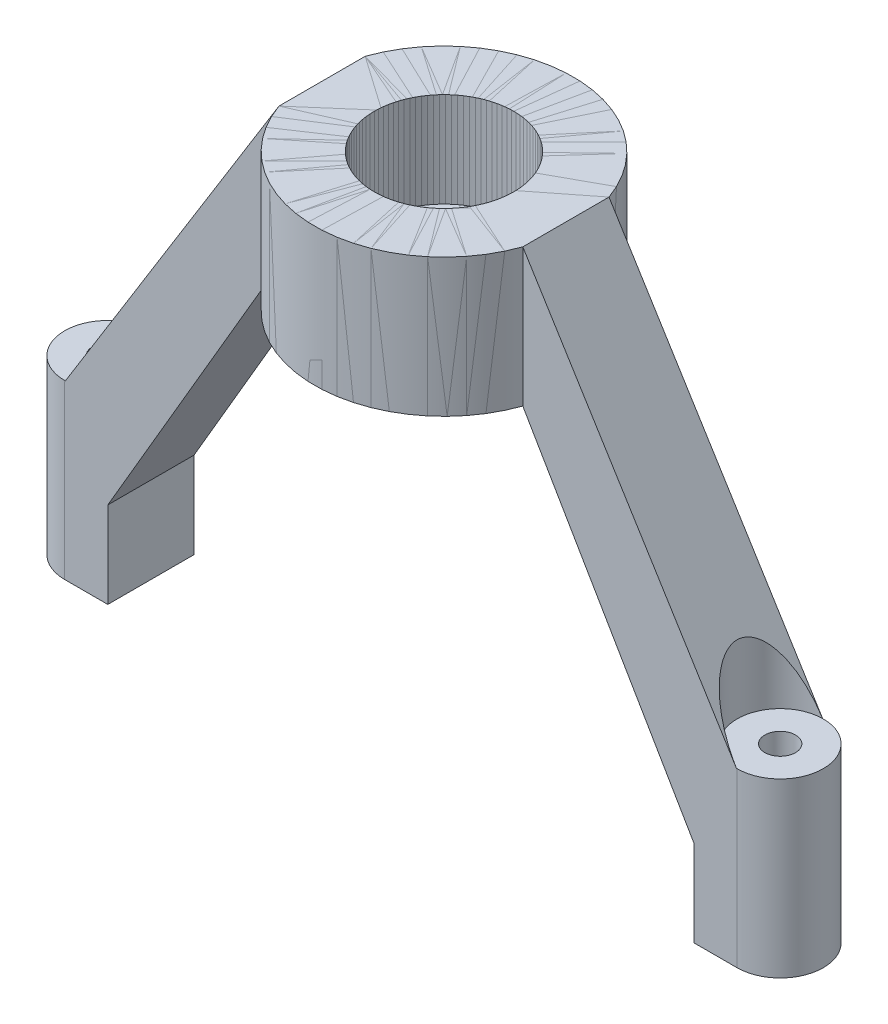
ISO-10303-21;
HEADER;
FILE_DESCRIPTION(('STEP AP214'),'2;1');
FILE_NAME('part.step','',(''),(''),'','','');
FILE_SCHEMA(('AUTOMOTIVE_DESIGN { 1 0 10303 214 1 1 1 1 }'));
ENDSEC;
DATA;
#1=APPLICATION_CONTEXT('core data for automotive mechanical design processes');
#2=APPLICATION_PROTOCOL_DEFINITION('international standard','automotive_design',2000,#1);
#3=PRODUCT_CONTEXT('',#1,'mechanical');
#4=PRODUCT('Part','Part','',(#3));
#5=PRODUCT_RELATED_PRODUCT_CATEGORY('part','',(#4));
#6=PRODUCT_DEFINITION_FORMATION('','',#4);
#7=PRODUCT_DEFINITION_CONTEXT('part definition',#1,'design');
#8=PRODUCT_DEFINITION('design','',#6,#7);
#9=PRODUCT_DEFINITION_SHAPE('','',#8);
#10=(LENGTH_UNIT() NAMED_UNIT(*) SI_UNIT(.MILLI.,.METRE.));
#11=(NAMED_UNIT(*) PLANE_ANGLE_UNIT() SI_UNIT($,.RADIAN.));
#12=(NAMED_UNIT(*) SI_UNIT($,.STERADIAN.) SOLID_ANGLE_UNIT());
#13=UNCERTAINTY_MEASURE_WITH_UNIT(LENGTH_MEASURE(1.E-05),#10,'distance_accuracy_value','');
#14=(GEOMETRIC_REPRESENTATION_CONTEXT(3) GLOBAL_UNCERTAINTY_ASSIGNED_CONTEXT((#13)) GLOBAL_UNIT_ASSIGNED_CONTEXT((#10,
#11,#12)) REPRESENTATION_CONTEXT('',''));
#15=CARTESIAN_POINT('',(0.,0.,0.));
#16=DIRECTION('',(0.,0.,1.));
#17=DIRECTION('',(1.,0.,0.));
#18=AXIS2_PLACEMENT_3D('',#15,#16,#17);
#19=CARTESIAN_POINT('',(0.,-12.,0.));
#20=DIRECTION('',(0.,1.,0.));
#21=DIRECTION('',(0.,0.,-1.));
#22=AXIS2_PLACEMENT_3D('',#19,#20,#21);
#23=PLANE('',#22);
#24=CARTESIAN_POINT('',(19.5,-12.,0.));
#25=DIRECTION('',(0.,1.,0.));
#26=DIRECTION('',(0.,0.,-1.));
#27=AXIS2_PLACEMENT_3D('',#24,#25,#26);
#28=CIRCLE('',#27,2.5);
#29=CARTESIAN_POINT('',(19.4623537948858,-12.,2.4997165365778));
#30=VERTEX_POINT('',#29);
#31=CARTESIAN_POINT('',(19.4623537948858,-12.,-2.4997165365778));
#32=VERTEX_POINT('',#31);
#33=EDGE_CURVE('E53',#30,#32,#28,.T.);
#34=ORIENTED_EDGE('',*,*,#33,.T.);
#35=CARTESIAN_POINT('',(19.5,-12.,0.));
#36=DIRECTION('',(0.,1.,0.));
#37=DIRECTION('',(0.,0.,-1.));
#38=AXIS2_PLACEMENT_3D('',#35,#36,#37);
#39=CIRCLE('',#38,2.5);
#40=EDGE_CURVE('E148',#32,#30,#39,.T.);
#41=ORIENTED_EDGE('',*,*,#40,.T.);
#42=EDGE_LOOP('',(#34,#41));
#43=FACE_BOUND('',#42,.T.);
#44=CARTESIAN_POINT('',(19.5,-12.,0.));
#45=DIRECTION('',(0.,1.,0.));
#46=DIRECTION('',(0.,0.,-1.));
#47=AXIS2_PLACEMENT_3D('',#44,#45,#46);
#48=CIRCLE('',#47,0.889);
#49=CARTESIAN_POINT('',(19.5,-12.,-0.889));
#50=VERTEX_POINT('',#49);
#51=EDGE_CURVE('E209',#50,#50,#48,.T.);
#52=ORIENTED_EDGE('',*,*,#51,.F.);
#53=EDGE_LOOP('',(#52));
#54=FACE_BOUND('',#53,.T.);
#55=ADVANCED_FACE('F45',(#43,#54),#23,.T.);
#56=CARTESIAN_POINT('',(7.07106781186548,8.,2.5));
#57=DIRECTION('',(0.850068521359442,0.526672107666403,0.));
#58=DIRECTION('',(0.526672107666403,-0.850068521359442,0.));
#59=AXIS2_PLACEMENT_3D('',#56,#57,#58);
#60=PLANE('',#59);
#61=CARTESIAN_POINT('',(19.5,-12.0607623860281,0.));
#62=DIRECTION('',(0.850068521359442,0.526672107666403,0.));
#63=DIRECTION('',(0.526672107666403,-0.850068521359442,0.));
#64=AXIS2_PLACEMENT_3D('',#61,#62,#63);
#65=ELLIPSE('',#64,4.74678640392992,2.5);
#66=CARTESIAN_POINT('',(19.5,-12.060762386028,2.5));
#67=VERTEX_POINT('',#66);
#68=EDGE_CURVE('E60',#30,#67,#65,.T.);
#69=ORIENTED_EDGE('',*,*,#68,.F.);
#70=CARTESIAN_POINT('',(19.5,-12.060762386028,0.));
#71=DIRECTION('',(0.850068521359442,0.526672107666403,0.));
#72=DIRECTION('',(0.526672107666403,-0.850068521359442,0.));
#73=AXIS2_PLACEMENT_3D('',#70,#71,#72);
#74=ELLIPSE('',#73,4.74678640392992,2.5);
#75=EDGE_CURVE('E12',#30,#32,#74,.F.);
#76=ORIENTED_EDGE('',*,*,#75,.T.);
#77=CARTESIAN_POINT('',(19.5,-12.060762386028,-2.5));
#78=VERTEX_POINT('',#77);
#79=EDGE_CURVE('E202',#78,#32,#65,.T.);
#80=ORIENTED_EDGE('',*,*,#79,.F.);
#81=DIRECTION('',(0.526672107666403,-0.850068521359442,0.));
#82=VECTOR('',#81,1.);
#83=CARTESIAN_POINT('',(7.07106781186548,8.,-2.5));
#84=LINE('',#83,#82);
#85=CARTESIAN_POINT('',(7.07106781186548,8.,-2.5));
#86=VERTEX_POINT('',#85);
#87=EDGE_CURVE('E186',#86,#78,#84,.T.);
#88=ORIENTED_EDGE('',*,*,#87,.F.);
#89=DIRECTION('',(0.,0.,-1.));
#90=VECTOR('',#89,1.);
#91=CARTESIAN_POINT('',(7.07106781186548,8.,2.5));
#92=LINE('',#91,#90);
#93=CARTESIAN_POINT('',(7.07106781186548,8.,2.5));
#94=VERTEX_POINT('',#93);
#95=EDGE_CURVE('E199',#94,#86,#92,.T.);
#96=ORIENTED_EDGE('',*,*,#95,.F.);
#97=DIRECTION('',(0.526672107666403,-0.850068521359442,0.));
#98=VECTOR('',#97,1.);
#99=CARTESIAN_POINT('',(7.07106781186548,8.,2.5));
#100=LINE('',#99,#98);
#101=EDGE_CURVE('E122',#94,#67,#100,.T.);
#102=ORIENTED_EDGE('',*,*,#101,.T.);
#103=EDGE_LOOP('',(#69,#76,#80,#88,#96,#102));
#104=FACE_BOUND('',#103,.T.);
#105=ADVANCED_FACE('F216',(#104),#60,.T.);
#106=CARTESIAN_POINT('',(19.5,-12.,0.));
#107=DIRECTION('',(0.,-1.,0.));
#108=DIRECTION('',(0.,0.,1.));
#109=AXIS2_PLACEMENT_3D('',#106,#107,#108);
#110=CYLINDRICAL_SURFACE('',#109,0.889);
#111=ORIENTED_EDGE('',*,*,#51,.T.);
#112=EDGE_LOOP('',(#111));
#113=FACE_BOUND('',#112,.T.);
#114=CARTESIAN_POINT('',(19.5,-22.,0.));
#115=DIRECTION('',(0.,-1.,0.));
#116=DIRECTION('',(0.,0.,1.));
#117=AXIS2_PLACEMENT_3D('',#114,#115,#116);
#118=CIRCLE('',#117,0.889);
#119=CARTESIAN_POINT('',(19.5,-22.,0.889));
#120=VERTEX_POINT('',#119);
#121=EDGE_CURVE('E138',#120,#120,#118,.T.);
#122=ORIENTED_EDGE('',*,*,#121,.T.);
#123=EDGE_LOOP('',(#122));
#124=FACE_BOUND('',#123,.T.);
#125=ADVANCED_FACE('F47',(#113,#124),#110,.F.);
#126=CARTESIAN_POINT('',(19.5,-12.,0.));
#127=DIRECTION('',(0.,-1.,0.));
#128=DIRECTION('',(0.,0.,1.));
#129=AXIS2_PLACEMENT_3D('',#126,#127,#128);
#130=CYLINDRICAL_SURFACE('',#129,2.5);
#131=ORIENTED_EDGE('',*,*,#33,.F.);
#132=ORIENTED_EDGE('',*,*,#68,.T.);
#133=DIRECTION('',(0.,-1.,0.));
#134=VECTOR('',#133,1.);
#135=CARTESIAN_POINT('',(19.5,-12.060762386028,2.5));
#136=LINE('',#135,#134);
#137=CARTESIAN_POINT('',(19.5,-22.,2.5));
#138=VERTEX_POINT('',#137);
#139=EDGE_CURVE('E114',#67,#138,#136,.T.);
#140=ORIENTED_EDGE('',*,*,#139,.T.);
#141=CARTESIAN_POINT('',(19.5,-22.,0.));
#142=DIRECTION('',(0.,-1.,0.));
#143=DIRECTION('',(0.,0.,1.));
#144=AXIS2_PLACEMENT_3D('',#141,#142,#143);
#145=CIRCLE('',#144,2.5);
#146=CARTESIAN_POINT('',(19.5,-22.,-2.5));
#147=VERTEX_POINT('',#146);
#148=EDGE_CURVE('E118',#147,#138,#145,.T.);
#149=ORIENTED_EDGE('',*,*,#148,.F.);
#150=DIRECTION('',(0.,-1.,0.));
#151=VECTOR('',#150,1.);
#152=CARTESIAN_POINT('',(19.5,-12.060762386028,-2.5));
#153=LINE('',#152,#151);
#154=EDGE_CURVE('E67',#78,#147,#153,.T.);
#155=ORIENTED_EDGE('',*,*,#154,.F.);
#156=ORIENTED_EDGE('',*,*,#79,.T.);
#157=EDGE_LOOP('',(#131,#132,#140,#149,#155,#156));
#158=FACE_BOUND('',#157,.T.);
#159=ADVANCED_FACE('F116',(#158),#130,.T.);
#160=CARTESIAN_POINT('',(17.,-17.,2.5));
#161=DIRECTION('',(-0.863507616056876,-0.504335797868613,0.));
#162=DIRECTION('',(-0.504335797868613,0.863507616056876,0.));
#163=AXIS2_PLACEMENT_3D('',#160,#161,#162);
#164=PLANE('',#163);
#165=DIRECTION('',(0.,0.,-1.));
#166=VECTOR('',#165,1.);
#167=CARTESIAN_POINT('',(7.07106781186548,0.,2.5));
#168=LINE('',#167,#166);
#169=CARTESIAN_POINT('',(7.07106781186548,0.,2.5));
#170=VERTEX_POINT('',#169);
#171=CARTESIAN_POINT('',(7.07106781186548,0.,-2.5));
#172=VERTEX_POINT('',#171);
#173=EDGE_CURVE('E200',#170,#172,#168,.T.);
#174=ORIENTED_EDGE('',*,*,#173,.T.);
#175=DIRECTION('',(-0.504335797868613,0.863507616056876,0.));
#176=VECTOR('',#175,1.);
#177=CARTESIAN_POINT('',(17.,-17.,-2.5));
#178=LINE('',#177,#176);
#179=CARTESIAN_POINT('',(17.,-17.,-2.5));
#180=VERTEX_POINT('',#179);
#181=EDGE_CURVE('E190',#180,#172,#178,.T.);
#182=ORIENTED_EDGE('',*,*,#181,.F.);
#183=DIRECTION('',(0.,0.,-1.));
#184=VECTOR('',#183,1.);
#185=CARTESIAN_POINT('',(17.,-17.,2.5));
#186=LINE('',#185,#184);
#187=CARTESIAN_POINT('',(17.,-17.,2.5));
#188=VERTEX_POINT('',#187);
#189=EDGE_CURVE('E203',#188,#180,#186,.T.);
#190=ORIENTED_EDGE('',*,*,#189,.F.);
#191=DIRECTION('',(-0.504335797868613,0.863507616056876,0.));
#192=VECTOR('',#191,1.);
#193=CARTESIAN_POINT('',(17.,-17.,2.5));
#194=LINE('',#193,#192);
#195=EDGE_CURVE('E121',#188,#170,#194,.T.);
#196=ORIENTED_EDGE('',*,*,#195,.T.);
#197=EDGE_LOOP('',(#174,#182,#190,#196));
#198=FACE_BOUND('',#197,.T.);
#199=ADVANCED_FACE('F235',(#198),#164,.T.);
#200=CARTESIAN_POINT('',(0.,0.,2.5));
#201=DIRECTION('',(0.,0.,1.));
#202=DIRECTION('',(1.,0.,0.));
#203=AXIS2_PLACEMENT_3D('',#200,#201,#202);
#204=PLANE('',#203);
#205=DIRECTION('',(0.,1.,0.));
#206=VECTOR('',#205,1.);
#207=CARTESIAN_POINT('',(7.07106781186548,0.,2.5));
#208=LINE('',#207,#206);
#209=EDGE_CURVE('E193',#170,#94,#208,.T.);
#210=ORIENTED_EDGE('',*,*,#209,.F.);
#211=ORIENTED_EDGE('',*,*,#195,.F.);
#212=DIRECTION('',(0.,1.,0.));
#213=VECTOR('',#212,1.);
#214=CARTESIAN_POINT('',(17.,-22.,2.5));
#215=LINE('',#214,#213);
#216=CARTESIAN_POINT('',(17.,-22.,2.5));
#217=VERTEX_POINT('',#216);
#218=EDGE_CURVE('E128',#217,#188,#215,.T.);
#219=ORIENTED_EDGE('',*,*,#218,.F.);
#220=DIRECTION('',(-1.,0.,0.));
#221=VECTOR('',#220,1.);
#222=CARTESIAN_POINT('',(19.5,-22.,2.5));
#223=LINE('',#222,#221);
#224=EDGE_CURVE('E125',#138,#217,#223,.T.);
#225=ORIENTED_EDGE('',*,*,#224,.F.);
#226=ORIENTED_EDGE('',*,*,#139,.F.);
#227=ORIENTED_EDGE('',*,*,#101,.F.);
#228=EDGE_LOOP('',(#210,#211,#219,#225,#226,#227));
#229=FACE_BOUND('',#228,.T.);
#230=ADVANCED_FACE('F126',(#229),#204,.T.);
#231=CARTESIAN_POINT('',(0.,0.,-2.5));
#232=DIRECTION('',(0.,0.,1.));
#233=DIRECTION('',(1.,0.,0.));
#234=AXIS2_PLACEMENT_3D('',#231,#232,#233);
#235=PLANE('',#234);
#236=DIRECTION('',(0.,1.,0.));
#237=VECTOR('',#236,1.);
#238=CARTESIAN_POINT('',(7.07106781186548,0.,-2.5));
#239=LINE('',#238,#237);
#240=EDGE_CURVE('E181',#172,#86,#239,.T.);
#241=ORIENTED_EDGE('',*,*,#240,.T.);
#242=ORIENTED_EDGE('',*,*,#87,.T.);
#243=ORIENTED_EDGE('',*,*,#154,.T.);
#244=DIRECTION('',(1.,0.,0.));
#245=VECTOR('',#244,1.);
#246=CARTESIAN_POINT('',(17.,-22.,-2.5));
#247=LINE('',#246,#245);
#248=CARTESIAN_POINT('',(17.,-22.,-2.5));
#249=VERTEX_POINT('',#248);
#250=EDGE_CURVE('E137',#249,#147,#247,.T.);
#251=ORIENTED_EDGE('',*,*,#250,.F.);
#252=DIRECTION('',(0.,1.,0.));
#253=VECTOR('',#252,1.);
#254=CARTESIAN_POINT('',(17.,-22.,-2.5));
#255=LINE('',#254,#253);
#256=EDGE_CURVE('E145',#249,#180,#255,.T.);
#257=ORIENTED_EDGE('',*,*,#256,.T.);
#258=ORIENTED_EDGE('',*,*,#181,.T.);
#259=EDGE_LOOP('',(#241,#242,#243,#251,#257,#258));
#260=FACE_BOUND('',#259,.T.);
#261=ADVANCED_FACE('F219',(#260),#235,.F.);
#262=CARTESIAN_POINT('',(0.,8.,0.));
#263=DIRECTION('',(0.,-1.,0.));
#264=DIRECTION('',(0.,0.,1.));
#265=AXIS2_PLACEMENT_3D('',#262,#263,#264);
#266=CYLINDRICAL_SURFACE('',#265,1.875);
#267=CARTESIAN_POINT('',(0.,0.,0.));
#268=DIRECTION('',(0.,1.,0.));
#269=DIRECTION('',(0.,0.,-1.));
#270=AXIS2_PLACEMENT_3D('',#267,#268,#269);
#271=CIRCLE('',#270,1.875);
#272=CARTESIAN_POINT('',(0.,0.,-1.875));
#273=VERTEX_POINT('',#272);
#274=EDGE_CURVE('E167',#273,#273,#271,.T.);
#275=ORIENTED_EDGE('',*,*,#274,.F.);
#276=EDGE_LOOP('',(#275));
#277=FACE_BOUND('',#276,.T.);
#278=CARTESIAN_POINT('',(0.,2.5,0.));
#279=DIRECTION('',(0.,1.,0.));
#280=DIRECTION('',(0.,0.,-1.));
#281=AXIS2_PLACEMENT_3D('',#278,#279,#280);
#282=CIRCLE('',#281,1.875);
#283=CARTESIAN_POINT('',(0.,2.5,-1.875));
#284=VERTEX_POINT('',#283);
#285=EDGE_CURVE('E154',#284,#284,#282,.T.);
#286=ORIENTED_EDGE('',*,*,#285,.T.);
#287=EDGE_LOOP('',(#286));
#288=FACE_BOUND('',#287,.T.);
#289=ADVANCED_FACE('F244',(#277,#288),#266,.F.);
#290=CARTESIAN_POINT('',(-7.07106781186548,8.,0.));
#291=DIRECTION('',(-1.,0.,0.));
#292=DIRECTION('',(0.,0.,1.));
#293=AXIS2_PLACEMENT_3D('',#290,#291,#292);
#294=PLANE('',#293);
#295=DIRECTION('',(0.,0.,-1.));
#296=VECTOR('',#295,1.);
#297=CARTESIAN_POINT('',(-7.07106781186548,0.,0.));
#298=LINE('',#297,#296);
#299=CARTESIAN_POINT('',(-7.07106781186548,0.,2.5));
#300=VERTEX_POINT('',#299);
#301=CARTESIAN_POINT('',(-7.07106781186548,0.,-2.5));
#302=VERTEX_POINT('',#301);
#303=EDGE_CURVE('E170',#300,#302,#298,.T.);
#304=ORIENTED_EDGE('',*,*,#303,.F.);
#305=DIRECTION('',(0.,-1.,0.));
#306=VECTOR('',#305,1.);
#307=CARTESIAN_POINT('',(-7.07106781186548,8.,2.5));
#308=LINE('',#307,#306);
#309=CARTESIAN_POINT('',(-7.07106781186548,8.,2.5));
#310=VERTEX_POINT('',#309);
#311=EDGE_CURVE('E179',#310,#300,#308,.T.);
#312=ORIENTED_EDGE('',*,*,#311,.F.);
#313=DIRECTION('',(0.,0.,-1.));
#314=VECTOR('',#313,1.);
#315=CARTESIAN_POINT('',(-7.07106781186548,8.,0.));
#316=LINE('',#315,#314);
#317=CARTESIAN_POINT('',(-7.07106781186548,8.,-2.5));
#318=VERTEX_POINT('',#317);
#319=EDGE_CURVE('E157',#310,#318,#316,.T.);
#320=ORIENTED_EDGE('',*,*,#319,.T.);
#321=DIRECTION('',(0.,-1.,0.));
#322=VECTOR('',#321,1.);
#323=CARTESIAN_POINT('',(-7.07106781186548,8.,-2.5));
#324=LINE('',#323,#322);
#325=EDGE_CURVE('E166',#318,#302,#324,.T.);
#326=ORIENTED_EDGE('',*,*,#325,.T.);
#327=EDGE_LOOP('',(#304,#312,#320,#326));
#328=FACE_BOUND('',#327,.T.);
#329=ADVANCED_FACE('F242',(#328),#294,.T.);
#330=CARTESIAN_POINT('',(0.,8.,0.));
#331=DIRECTION('',(0.,-1.,0.));
#332=DIRECTION('',(0.,0.,1.));
#333=AXIS2_PLACEMENT_3D('',#330,#331,#332);
#334=CYLINDRICAL_SURFACE('',#333,7.5);
#335=CARTESIAN_POINT('',(0.,0.,0.));
#336=DIRECTION('',(0.,1.,0.));
#337=DIRECTION('',(0.,0.,-1.));
#338=AXIS2_PLACEMENT_3D('',#335,#336,#337);
#339=CIRCLE('',#338,7.5);
#340=EDGE_CURVE('E173',#300,#170,#339,.T.);
#341=ORIENTED_EDGE('',*,*,#340,.T.);
#342=ORIENTED_EDGE('',*,*,#209,.T.);
#343=CARTESIAN_POINT('',(0.,8.,0.));
#344=DIRECTION('',(0.,1.,0.));
#345=DIRECTION('',(0.,0.,-1.));
#346=AXIS2_PLACEMENT_3D('',#343,#344,#345);
#347=CIRCLE('',#346,7.5);
#348=EDGE_CURVE('E160',#310,#94,#347,.T.);
#349=ORIENTED_EDGE('',*,*,#348,.F.);
#350=ORIENTED_EDGE('',*,*,#311,.T.);
#351=EDGE_LOOP('',(#341,#342,#349,#350));
#352=FACE_BOUND('',#351,.T.);
#353=ADVANCED_FACE('F240',(#352),#334,.T.);
#354=CARTESIAN_POINT('',(0.,8.,0.));
#355=DIRECTION('',(0.,-1.,0.));
#356=DIRECTION('',(0.,0.,1.));
#357=AXIS2_PLACEMENT_3D('',#354,#355,#356);
#358=CYLINDRICAL_SURFACE('',#357,7.5);
#359=CARTESIAN_POINT('',(0.,0.,0.));
#360=DIRECTION('',(0.,1.,0.));
#361=DIRECTION('',(0.,0.,-1.));
#362=AXIS2_PLACEMENT_3D('',#359,#360,#361);
#363=CIRCLE('',#362,7.5);
#364=EDGE_CURVE('E161',#172,#302,#363,.T.);
#365=ORIENTED_EDGE('',*,*,#364,.T.);
#366=ORIENTED_EDGE('',*,*,#325,.F.);
#367=CARTESIAN_POINT('',(0.,8.,0.));
#368=DIRECTION('',(0.,1.,0.));
#369=DIRECTION('',(0.,0.,-1.));
#370=AXIS2_PLACEMENT_3D('',#367,#368,#369);
#371=CIRCLE('',#370,7.5);
#372=EDGE_CURVE('E164',#86,#318,#371,.T.);
#373=ORIENTED_EDGE('',*,*,#372,.F.);
#374=ORIENTED_EDGE('',*,*,#240,.F.);
#375=EDGE_LOOP('',(#365,#366,#373,#374));
#376=FACE_BOUND('',#375,.T.);
#377=ADVANCED_FACE('F226',(#376),#358,.T.);
#378=CARTESIAN_POINT('',(0.,8.,0.));
#379=DIRECTION('',(0.,1.,0.));
#380=DIRECTION('',(0.,0.,-1.));
#381=AXIS2_PLACEMENT_3D('',#378,#379,#380);
#382=PLANE('',#381);
#383=CARTESIAN_POINT('',(0.,8.,0.));
#384=DIRECTION('',(0.,1.,0.));
#385=DIRECTION('',(0.,0.,-1.));
#386=AXIS2_PLACEMENT_3D('',#383,#384,#385);
#387=CIRCLE('',#386,4.05);
#388=CARTESIAN_POINT('',(0.,8.,-4.05));
#389=VERTEX_POINT('',#388);
#390=EDGE_CURVE('E150',#389,#389,#387,.T.);
#391=ORIENTED_EDGE('',*,*,#390,.F.);
#392=EDGE_LOOP('',(#391));
#393=FACE_BOUND('',#392,.T.);
#394=ORIENTED_EDGE('',*,*,#319,.F.);
#395=ORIENTED_EDGE('',*,*,#348,.T.);
#396=ORIENTED_EDGE('',*,*,#95,.T.);
#397=ORIENTED_EDGE('',*,*,#372,.T.);
#398=EDGE_LOOP('',(#394,#395,#396,#397));
#399=FACE_BOUND('',#398,.T.);
#400=ADVANCED_FACE('F229',(#393,#399),#382,.T.);
#401=CARTESIAN_POINT('',(0.,0.,0.));
#402=DIRECTION('',(0.,1.,0.));
#403=DIRECTION('',(0.,0.,-1.));
#404=AXIS2_PLACEMENT_3D('',#401,#402,#403);
#405=PLANE('',#404);
#406=ORIENTED_EDGE('',*,*,#274,.T.);
#407=EDGE_LOOP('',(#406));
#408=FACE_BOUND('',#407,.T.);
#409=ORIENTED_EDGE('',*,*,#303,.T.);
#410=ORIENTED_EDGE('',*,*,#364,.F.);
#411=ORIENTED_EDGE('',*,*,#173,.F.);
#412=ORIENTED_EDGE('',*,*,#340,.F.);
#413=EDGE_LOOP('',(#409,#410,#411,#412));
#414=FACE_BOUND('',#413,.T.);
#415=ADVANCED_FACE('F238',(#408,#414),#405,.F.);
#416=CARTESIAN_POINT('',(0.,2.5,0.));
#417=DIRECTION('',(0.,1.,0.));
#418=DIRECTION('',(0.,0.,-1.));
#419=AXIS2_PLACEMENT_3D('',#416,#417,#418);
#420=CYLINDRICAL_SURFACE('',#419,4.05);
#421=CARTESIAN_POINT('',(0.,2.5,0.));
#422=DIRECTION('',(0.,1.,0.));
#423=DIRECTION('',(0.,0.,-1.));
#424=AXIS2_PLACEMENT_3D('',#421,#422,#423);
#425=CIRCLE('',#424,4.05);
#426=CARTESIAN_POINT('',(0.,2.5,-4.05));
#427=VERTEX_POINT('',#426);
#428=EDGE_CURVE('E151',#427,#427,#425,.T.);
#429=ORIENTED_EDGE('',*,*,#428,.F.);
#430=EDGE_LOOP('',(#429));
#431=FACE_BOUND('',#430,.T.);
#432=ORIENTED_EDGE('',*,*,#390,.T.);
#433=EDGE_LOOP('',(#432));
#434=FACE_BOUND('',#433,.T.);
#435=ADVANCED_FACE('F287',(#431,#434),#420,.F.);
#436=CARTESIAN_POINT('',(0.,2.5,0.));
#437=DIRECTION('',(0.,1.,0.));
#438=DIRECTION('',(0.,0.,-1.));
#439=AXIS2_PLACEMENT_3D('',#436,#437,#438);
#440=PLANE('',#439);
#441=ORIENTED_EDGE('',*,*,#285,.F.);
#442=EDGE_LOOP('',(#441));
#443=FACE_BOUND('',#442,.T.);
#444=ORIENTED_EDGE('',*,*,#428,.T.);
#445=EDGE_LOOP('',(#444));
#446=FACE_BOUND('',#445,.T.);
#447=ADVANCED_FACE('F281',(#443,#446),#440,.T.);
#448=CARTESIAN_POINT('',(19.5,8.,0.));
#449=DIRECTION('',(0.,-1.,0.));
#450=DIRECTION('',(0.,0.,1.));
#451=AXIS2_PLACEMENT_3D('',#448,#449,#450);
#452=CYLINDRICAL_SURFACE('',#451,2.5);
#453=ORIENTED_EDGE('',*,*,#40,.F.);
#454=ORIENTED_EDGE('',*,*,#75,.F.);
#455=EDGE_LOOP('',(#453,#454));
#456=FACE_BOUND('',#455,.T.);
#457=ADVANCED_FACE('F273',(#456),#452,.F.);
#458=CARTESIAN_POINT('',(19.5,-22.,0.));
#459=DIRECTION('',(0.,-1.,0.));
#460=DIRECTION('',(0.,0.,1.));
#461=AXIS2_PLACEMENT_3D('',#458,#459,#460);
#462=PLANE('',#461);
#463=ORIENTED_EDGE('',*,*,#148,.T.);
#464=ORIENTED_EDGE('',*,*,#224,.T.);
#465=DIRECTION('',(0.,0.,-1.));
#466=VECTOR('',#465,1.);
#467=CARTESIAN_POINT('',(17.,-22.,2.5));
#468=LINE('',#467,#466);
#469=EDGE_CURVE('E131',#217,#249,#468,.T.);
#470=ORIENTED_EDGE('',*,*,#469,.T.);
#471=ORIENTED_EDGE('',*,*,#250,.T.);
#472=EDGE_LOOP('',(#463,#464,#470,#471));
#473=FACE_BOUND('',#472,.T.);
#474=ORIENTED_EDGE('',*,*,#121,.F.);
#475=EDGE_LOOP('',(#474));
#476=FACE_BOUND('',#475,.T.);
#477=ADVANCED_FACE('F134',(#473,#476),#462,.T.);
#478=CARTESIAN_POINT('',(17.,-22.,2.5));
#479=DIRECTION('',(1.,0.,0.));
#480=DIRECTION('',(0.,0.,-1.));
#481=AXIS2_PLACEMENT_3D('',#478,#479,#480);
#482=PLANE('',#481);
#483=ORIENTED_EDGE('',*,*,#189,.T.);
#484=ORIENTED_EDGE('',*,*,#256,.F.);
#485=ORIENTED_EDGE('',*,*,#469,.F.);
#486=ORIENTED_EDGE('',*,*,#218,.T.);
#487=EDGE_LOOP('',(#483,#484,#485,#486));
#488=FACE_BOUND('',#487,.T.);
#489=ADVANCED_FACE('F272',(#488),#482,.F.);
#490=CLOSED_SHELL('',(#55,#105,#125,#159,#199,#230,#261,#289,#329,#353,#377,#400,#415,#435,#447,
#457,#477,#489));
#491=MANIFOLD_SOLID_BREP('B2',#490);
#492=CARTESIAN_POINT('',(0.,-12.,0.));
#493=DIRECTION('',(0.,1.,0.));
#494=DIRECTION('',(0.,0.,1.));
#495=AXIS2_PLACEMENT_3D('',#492,#493,#494);
#496=PLANE('',#495);
#497=CARTESIAN_POINT('',(-19.5,-12.,0.));
#498=DIRECTION('',(0.,1.,0.));
#499=DIRECTION('',(0.,0.,1.));
#500=AXIS2_PLACEMENT_3D('',#497,#498,#499);
#501=CIRCLE('',#500,2.5);
#502=CARTESIAN_POINT('',(-19.4623537948858,-12.,-2.4997165365778));
#503=VERTEX_POINT('',#502);
#504=CARTESIAN_POINT('',(-19.4623537948858,-12.,2.4997165365778));
#505=VERTEX_POINT('',#504);
#506=EDGE_CURVE('E441',#503,#505,#501,.T.);
#507=ORIENTED_EDGE('',*,*,#506,.T.);
#508=CARTESIAN_POINT('',(-19.5,-12.,0.));
#509=DIRECTION('',(0.,1.,0.));
#510=DIRECTION('',(0.,0.,1.));
#511=AXIS2_PLACEMENT_3D('',#508,#509,#510);
#512=CIRCLE('',#511,2.5);
#513=EDGE_CURVE('E536',#505,#503,#512,.T.);
#514=ORIENTED_EDGE('',*,*,#513,.T.);
#515=EDGE_LOOP('',(#507,#514));
#516=FACE_BOUND('',#515,.T.);
#517=CARTESIAN_POINT('',(-19.5,-12.,0.));
#518=DIRECTION('',(0.,1.,0.));
#519=DIRECTION('',(0.,0.,1.));
#520=AXIS2_PLACEMENT_3D('',#517,#518,#519);
#521=CIRCLE('',#520,0.889);
#522=CARTESIAN_POINT('',(-19.5,-12.,0.889));
#523=VERTEX_POINT('',#522);
#524=EDGE_CURVE('E597',#523,#523,#521,.T.);
#525=ORIENTED_EDGE('',*,*,#524,.F.);
#526=EDGE_LOOP('',(#525));
#527=FACE_BOUND('',#526,.T.);
#528=ADVANCED_FACE('F433',(#516,#527),#496,.T.);
#529=CARTESIAN_POINT('',(-7.07106781186548,8.,-2.5));
#530=DIRECTION('',(-0.850068521359442,0.526672107666403,0.));
#531=DIRECTION('',(-0.526672107666403,-0.850068521359442,0.));
#532=AXIS2_PLACEMENT_3D('',#529,#530,#531);
#533=PLANE('',#532);
#534=CARTESIAN_POINT('',(-19.5,-12.0607623860281,0.));
#535=DIRECTION('',(-0.850068521359442,0.526672107666403,0.));
#536=DIRECTION('',(-0.526672107666403,-0.850068521359442,0.));
#537=AXIS2_PLACEMENT_3D('',#534,#535,#536);
#538=ELLIPSE('',#537,4.74678640392992,2.5);
#539=CARTESIAN_POINT('',(-19.5,-12.060762386028,-2.5));
#540=VERTEX_POINT('',#539);
#541=EDGE_CURVE('E448',#503,#540,#538,.T.);
#542=ORIENTED_EDGE('',*,*,#541,.F.);
#543=CARTESIAN_POINT('',(-19.5,-12.060762386028,0.));
#544=DIRECTION('',(-0.850068521359442,0.526672107666403,0.));
#545=DIRECTION('',(-0.526672107666403,-0.850068521359442,0.));
#546=AXIS2_PLACEMENT_3D('',#543,#544,#545);
#547=ELLIPSE('',#546,4.74678640392992,2.5);
#548=EDGE_CURVE('E43',#503,#505,#547,.F.);
#549=ORIENTED_EDGE('',*,*,#548,.T.);
#550=CARTESIAN_POINT('',(-19.5,-12.060762386028,2.5));
#551=VERTEX_POINT('',#550);
#552=EDGE_CURVE('E590',#551,#505,#538,.T.);
#553=ORIENTED_EDGE('',*,*,#552,.F.);
#554=DIRECTION('',(-0.526672107666403,-0.850068521359442,0.));
#555=VECTOR('',#554,1.);
#556=CARTESIAN_POINT('',(-7.07106781186548,8.,2.5));
#557=LINE('',#556,#555);
#558=CARTESIAN_POINT('',(-7.07106781186548,8.,2.5));
#559=VERTEX_POINT('',#558);
#560=EDGE_CURVE('E574',#559,#551,#557,.T.);
#561=ORIENTED_EDGE('',*,*,#560,.F.);
#562=DIRECTION('',(0.,0.,1.));
#563=VECTOR('',#562,1.);
#564=CARTESIAN_POINT('',(-7.07106781186548,8.,-2.5));
#565=LINE('',#564,#563);
#566=CARTESIAN_POINT('',(-7.07106781186548,8.,-2.5));
#567=VERTEX_POINT('',#566);
#568=EDGE_CURVE('E587',#567,#559,#565,.T.);
#569=ORIENTED_EDGE('',*,*,#568,.F.);
#570=DIRECTION('',(-0.526672107666403,-0.850068521359442,0.));
#571=VECTOR('',#570,1.);
#572=CARTESIAN_POINT('',(-7.07106781186548,8.,-2.5));
#573=LINE('',#572,#571);
#574=EDGE_CURVE('E510',#567,#540,#573,.T.);
#575=ORIENTED_EDGE('',*,*,#574,.T.);
#576=EDGE_LOOP('',(#542,#549,#553,#561,#569,#575));
#577=FACE_BOUND('',#576,.T.);
#578=ADVANCED_FACE('F604',(#577),#533,.T.);
#579=CARTESIAN_POINT('',(-19.5,-12.,0.));
#580=DIRECTION('',(0.,-1.,0.));
#581=DIRECTION('',(0.,0.,-1.));
#582=AXIS2_PLACEMENT_3D('',#579,#580,#581);
#583=CYLINDRICAL_SURFACE('',#582,0.889);
#584=ORIENTED_EDGE('',*,*,#524,.T.);
#585=EDGE_LOOP('',(#584));
#586=FACE_BOUND('',#585,.T.);
#587=CARTESIAN_POINT('',(-19.5,-22.,0.));
#588=DIRECTION('',(0.,-1.,0.));
#589=DIRECTION('',(0.,0.,-1.));
#590=AXIS2_PLACEMENT_3D('',#587,#588,#589);
#591=CIRCLE('',#590,0.889);
#592=CARTESIAN_POINT('',(-19.5,-22.,-0.889));
#593=VERTEX_POINT('',#592);
#594=EDGE_CURVE('E526',#593,#593,#591,.T.);
#595=ORIENTED_EDGE('',*,*,#594,.T.);
#596=EDGE_LOOP('',(#595));
#597=FACE_BOUND('',#596,.T.);
#598=ADVANCED_FACE('F435',(#586,#597),#583,.F.);
#599=CARTESIAN_POINT('',(-19.5,-12.,0.));
#600=DIRECTION('',(0.,-1.,0.));
#601=DIRECTION('',(0.,0.,-1.));
#602=AXIS2_PLACEMENT_3D('',#599,#600,#601);
#603=CYLINDRICAL_SURFACE('',#602,2.5);
#604=ORIENTED_EDGE('',*,*,#506,.F.);
#605=ORIENTED_EDGE('',*,*,#541,.T.);
#606=DIRECTION('',(0.,-1.,0.));
#607=VECTOR('',#606,1.);
#608=CARTESIAN_POINT('',(-19.5,-12.060762386028,-2.5));
#609=LINE('',#608,#607);
#610=CARTESIAN_POINT('',(-19.5,-22.,-2.5));
#611=VERTEX_POINT('',#610);
#612=EDGE_CURVE('E502',#540,#611,#609,.T.);
#613=ORIENTED_EDGE('',*,*,#612,.T.);
#614=CARTESIAN_POINT('',(-19.5,-22.,0.));
#615=DIRECTION('',(0.,-1.,0.));
#616=DIRECTION('',(0.,0.,-1.));
#617=AXIS2_PLACEMENT_3D('',#614,#615,#616);
#618=CIRCLE('',#617,2.5);
#619=CARTESIAN_POINT('',(-19.5,-22.,2.5));
#620=VERTEX_POINT('',#619);
#621=EDGE_CURVE('E506',#620,#611,#618,.T.);
#622=ORIENTED_EDGE('',*,*,#621,.F.);
#623=DIRECTION('',(0.,-1.,0.));
#624=VECTOR('',#623,1.);
#625=CARTESIAN_POINT('',(-19.5,-12.060762386028,2.5));
#626=LINE('',#625,#624);
#627=EDGE_CURVE('E455',#551,#620,#626,.T.);
#628=ORIENTED_EDGE('',*,*,#627,.F.);
#629=ORIENTED_EDGE('',*,*,#552,.T.);
#630=EDGE_LOOP('',(#604,#605,#613,#622,#628,#629));
#631=FACE_BOUND('',#630,.T.);
#632=ADVANCED_FACE('F504',(#631),#603,.T.);
#633=CARTESIAN_POINT('',(-17.,-17.,-2.5));
#634=DIRECTION('',(0.863507616056876,-0.504335797868613,0.));
#635=DIRECTION('',(0.504335797868613,0.863507616056876,0.));
#636=AXIS2_PLACEMENT_3D('',#633,#634,#635);
#637=PLANE('',#636);
#638=DIRECTION('',(0.,0.,1.));
#639=VECTOR('',#638,1.);
#640=CARTESIAN_POINT('',(-7.07106781186548,0.,-2.5));
#641=LINE('',#640,#639);
#642=CARTESIAN_POINT('',(-7.07106781186548,0.,-2.5));
#643=VERTEX_POINT('',#642);
#644=CARTESIAN_POINT('',(-7.07106781186548,0.,2.5));
#645=VERTEX_POINT('',#644);
#646=EDGE_CURVE('E588',#643,#645,#641,.T.);
#647=ORIENTED_EDGE('',*,*,#646,.T.);
#648=DIRECTION('',(0.504335797868613,0.863507616056876,0.));
#649=VECTOR('',#648,1.);
#650=CARTESIAN_POINT('',(-17.,-17.,2.5));
#651=LINE('',#650,#649);
#652=CARTESIAN_POINT('',(-17.,-17.,2.5));
#653=VERTEX_POINT('',#652);
#654=EDGE_CURVE('E578',#653,#645,#651,.T.);
#655=ORIENTED_EDGE('',*,*,#654,.F.);
#656=DIRECTION('',(0.,0.,1.));
#657=VECTOR('',#656,1.);
#658=CARTESIAN_POINT('',(-17.,-17.,-2.5));
#659=LINE('',#658,#657);
#660=CARTESIAN_POINT('',(-17.,-17.,-2.5));
#661=VERTEX_POINT('',#660);
#662=EDGE_CURVE('E591',#661,#653,#659,.T.);
#663=ORIENTED_EDGE('',*,*,#662,.F.);
#664=DIRECTION('',(0.504335797868613,0.863507616056876,0.));
#665=VECTOR('',#664,1.);
#666=CARTESIAN_POINT('',(-17.,-17.,-2.5));
#667=LINE('',#666,#665);
#668=EDGE_CURVE('E509',#661,#643,#667,.T.);
#669=ORIENTED_EDGE('',*,*,#668,.T.);
#670=EDGE_LOOP('',(#647,#655,#663,#669));
#671=FACE_BOUND('',#670,.T.);
#672=ADVANCED_FACE('F623',(#671),#637,.T.);
#673=CARTESIAN_POINT('',(0.,0.,-2.5));
#674=DIRECTION('',(0.,0.,-1.));
#675=DIRECTION('',(-1.,0.,0.));
#676=AXIS2_PLACEMENT_3D('',#673,#674,#675);
#677=PLANE('',#676);
#678=DIRECTION('',(0.,1.,0.));
#679=VECTOR('',#678,1.);
#680=CARTESIAN_POINT('',(-7.07106781186548,0.,-2.5));
#681=LINE('',#680,#679);
#682=EDGE_CURVE('E581',#643,#567,#681,.T.);
#683=ORIENTED_EDGE('',*,*,#682,.F.);
#684=ORIENTED_EDGE('',*,*,#668,.F.);
#685=DIRECTION('',(0.,1.,0.));
#686=VECTOR('',#685,1.);
#687=CARTESIAN_POINT('',(-17.,-22.,-2.5));
#688=LINE('',#687,#686);
#689=CARTESIAN_POINT('',(-17.,-22.,-2.5));
#690=VERTEX_POINT('',#689);
#691=EDGE_CURVE('E516',#690,#661,#688,.T.);
#692=ORIENTED_EDGE('',*,*,#691,.F.);
#693=DIRECTION('',(1.,0.,0.));
#694=VECTOR('',#693,1.);
#695=CARTESIAN_POINT('',(-19.5,-22.,-2.5));
#696=LINE('',#695,#694);
#697=EDGE_CURVE('E513',#611,#690,#696,.T.);
#698=ORIENTED_EDGE('',*,*,#697,.F.);
#699=ORIENTED_EDGE('',*,*,#612,.F.);
#700=ORIENTED_EDGE('',*,*,#574,.F.);
#701=EDGE_LOOP('',(#683,#684,#692,#698,#699,#700));
#702=FACE_BOUND('',#701,.T.);
#703=ADVANCED_FACE('F514',(#702),#677,.T.);
#704=CARTESIAN_POINT('',(0.,0.,2.5));
#705=DIRECTION('',(0.,0.,-1.));
#706=DIRECTION('',(-1.,0.,0.));
#707=AXIS2_PLACEMENT_3D('',#704,#705,#706);
#708=PLANE('',#707);
#709=DIRECTION('',(0.,1.,0.));
#710=VECTOR('',#709,1.);
#711=CARTESIAN_POINT('',(-7.07106781186548,0.,2.5));
#712=LINE('',#711,#710);
#713=EDGE_CURVE('E569',#645,#559,#712,.T.);
#714=ORIENTED_EDGE('',*,*,#713,.T.);
#715=ORIENTED_EDGE('',*,*,#560,.T.);
#716=ORIENTED_EDGE('',*,*,#627,.T.);
#717=DIRECTION('',(-1.,0.,0.));
#718=VECTOR('',#717,1.);
#719=CARTESIAN_POINT('',(-17.,-22.,2.5));
#720=LINE('',#719,#718);
#721=CARTESIAN_POINT('',(-17.,-22.,2.5));
#722=VERTEX_POINT('',#721);
#723=EDGE_CURVE('E525',#722,#620,#720,.T.);
#724=ORIENTED_EDGE('',*,*,#723,.F.);
#725=DIRECTION('',(0.,1.,0.));
#726=VECTOR('',#725,1.);
#727=CARTESIAN_POINT('',(-17.,-22.,2.5));
#728=LINE('',#727,#726);
#729=EDGE_CURVE('E533',#722,#653,#728,.T.);
#730=ORIENTED_EDGE('',*,*,#729,.T.);
#731=ORIENTED_EDGE('',*,*,#654,.T.);
#732=EDGE_LOOP('',(#714,#715,#716,#724,#730,#731));
#733=FACE_BOUND('',#732,.T.);
#734=ADVANCED_FACE('F607',(#733),#708,.F.);
#735=CARTESIAN_POINT('',(0.,8.,0.));
#736=DIRECTION('',(0.,-1.,0.));
#737=DIRECTION('',(0.,0.,-1.));
#738=AXIS2_PLACEMENT_3D('',#735,#736,#737);
#739=CYLINDRICAL_SURFACE('',#738,1.875);
#740=CARTESIAN_POINT('',(0.,0.,0.));
#741=DIRECTION('',(0.,1.,0.));
#742=DIRECTION('',(0.,0.,1.));
#743=AXIS2_PLACEMENT_3D('',#740,#741,#742);
#744=CIRCLE('',#743,1.875);
#745=CARTESIAN_POINT('',(0.,0.,1.875));
#746=VERTEX_POINT('',#745);
#747=EDGE_CURVE('E555',#746,#746,#744,.T.);
#748=ORIENTED_EDGE('',*,*,#747,.F.);
#749=EDGE_LOOP('',(#748));
#750=FACE_BOUND('',#749,.T.);
#751=CARTESIAN_POINT('',(0.,2.5,0.));
#752=DIRECTION('',(0.,1.,0.));
#753=DIRECTION('',(0.,0.,1.));
#754=AXIS2_PLACEMENT_3D('',#751,#752,#753);
#755=CIRCLE('',#754,1.875);
#756=CARTESIAN_POINT('',(0.,2.5,1.875));
#757=VERTEX_POINT('',#756);
#758=EDGE_CURVE('E542',#757,#757,#755,.T.);
#759=ORIENTED_EDGE('',*,*,#758,.T.);
#760=EDGE_LOOP('',(#759));
#761=FACE_BOUND('',#760,.T.);
#762=ADVANCED_FACE('F632',(#750,#761),#739,.F.);
#763=CARTESIAN_POINT('',(7.07106781186548,8.,0.));
#764=DIRECTION('',(1.,0.,0.));
#765=DIRECTION('',(0.,0.,-1.));
#766=AXIS2_PLACEMENT_3D('',#763,#764,#765);
#767=PLANE('',#766);
#768=DIRECTION('',(0.,0.,1.));
#769=VECTOR('',#768,1.);
#770=CARTESIAN_POINT('',(7.07106781186548,0.,0.));
#771=LINE('',#770,#769);
#772=CARTESIAN_POINT('',(7.07106781186548,0.,-2.5));
#773=VERTEX_POINT('',#772);
#774=CARTESIAN_POINT('',(7.07106781186548,0.,2.5));
#775=VERTEX_POINT('',#774);
#776=EDGE_CURVE('E558',#773,#775,#771,.T.);
#777=ORIENTED_EDGE('',*,*,#776,.F.);
#778=DIRECTION('',(0.,-1.,0.));
#779=VECTOR('',#778,1.);
#780=CARTESIAN_POINT('',(7.07106781186548,8.,-2.5));
#781=LINE('',#780,#779);
#782=CARTESIAN_POINT('',(7.07106781186548,8.,-2.5));
#783=VERTEX_POINT('',#782);
#784=EDGE_CURVE('E567',#783,#773,#781,.T.);
#785=ORIENTED_EDGE('',*,*,#784,.F.);
#786=DIRECTION('',(0.,0.,1.));
#787=VECTOR('',#786,1.);
#788=CARTESIAN_POINT('',(7.07106781186548,8.,0.));
#789=LINE('',#788,#787);
#790=CARTESIAN_POINT('',(7.07106781186548,8.,2.5));
#791=VERTEX_POINT('',#790);
#792=EDGE_CURVE('E545',#783,#791,#789,.T.);
#793=ORIENTED_EDGE('',*,*,#792,.T.);
#794=DIRECTION('',(0.,-1.,0.));
#795=VECTOR('',#794,1.);
#796=CARTESIAN_POINT('',(7.07106781186548,8.,2.5));
#797=LINE('',#796,#795);
#798=EDGE_CURVE('E554',#791,#775,#797,.T.);
#799=ORIENTED_EDGE('',*,*,#798,.T.);
#800=EDGE_LOOP('',(#777,#785,#793,#799));
#801=FACE_BOUND('',#800,.T.);
#802=ADVANCED_FACE('F630',(#801),#767,.T.);
#803=CARTESIAN_POINT('',(0.,8.,0.));
#804=DIRECTION('',(0.,-1.,0.));
#805=DIRECTION('',(0.,0.,-1.));
#806=AXIS2_PLACEMENT_3D('',#803,#804,#805);
#807=CYLINDRICAL_SURFACE('',#806,7.5);
#808=CARTESIAN_POINT('',(0.,0.,0.));
#809=DIRECTION('',(0.,1.,0.));
#810=DIRECTION('',(0.,0.,1.));
#811=AXIS2_PLACEMENT_3D('',#808,#809,#810);
#812=CIRCLE('',#811,7.5);
#813=EDGE_CURVE('E561',#773,#643,#812,.T.);
#814=ORIENTED_EDGE('',*,*,#813,.T.);
#815=ORIENTED_EDGE('',*,*,#682,.T.);
#816=CARTESIAN_POINT('',(0.,8.,0.));
#817=DIRECTION('',(0.,1.,0.));
#818=DIRECTION('',(0.,0.,1.));
#819=AXIS2_PLACEMENT_3D('',#816,#817,#818);
#820=CIRCLE('',#819,7.5);
#821=EDGE_CURVE('E548',#783,#567,#820,.T.);
#822=ORIENTED_EDGE('',*,*,#821,.F.);
#823=ORIENTED_EDGE('',*,*,#784,.T.);
#824=EDGE_LOOP('',(#814,#815,#822,#823));
#825=FACE_BOUND('',#824,.T.);
#826=ADVANCED_FACE('F628',(#825),#807,.T.);
#827=CARTESIAN_POINT('',(0.,8.,0.));
#828=DIRECTION('',(0.,-1.,0.));
#829=DIRECTION('',(0.,0.,-1.));
#830=AXIS2_PLACEMENT_3D('',#827,#828,#829);
#831=CYLINDRICAL_SURFACE('',#830,7.5);
#832=CARTESIAN_POINT('',(0.,0.,0.));
#833=DIRECTION('',(0.,1.,0.));
#834=DIRECTION('',(0.,0.,1.));
#835=AXIS2_PLACEMENT_3D('',#832,#833,#834);
#836=CIRCLE('',#835,7.5);
#837=EDGE_CURVE('E549',#645,#775,#836,.T.);
#838=ORIENTED_EDGE('',*,*,#837,.T.);
#839=ORIENTED_EDGE('',*,*,#798,.F.);
#840=CARTESIAN_POINT('',(0.,8.,0.));
#841=DIRECTION('',(0.,1.,0.));
#842=DIRECTION('',(0.,0.,1.));
#843=AXIS2_PLACEMENT_3D('',#840,#841,#842);
#844=CIRCLE('',#843,7.5);
#845=EDGE_CURVE('E552',#559,#791,#844,.T.);
#846=ORIENTED_EDGE('',*,*,#845,.F.);
#847=ORIENTED_EDGE('',*,*,#713,.F.);
#848=EDGE_LOOP('',(#838,#839,#846,#847));
#849=FACE_BOUND('',#848,.T.);
#850=ADVANCED_FACE('F614',(#849),#831,.T.);
#851=CARTESIAN_POINT('',(0.,8.,0.));
#852=DIRECTION('',(0.,1.,0.));
#853=DIRECTION('',(0.,0.,1.));
#854=AXIS2_PLACEMENT_3D('',#851,#852,#853);
#855=PLANE('',#854);
#856=CARTESIAN_POINT('',(0.,8.,0.));
#857=DIRECTION('',(0.,1.,0.));
#858=DIRECTION('',(0.,0.,1.));
#859=AXIS2_PLACEMENT_3D('',#856,#857,#858);
#860=CIRCLE('',#859,4.05);
#861=CARTESIAN_POINT('',(0.,8.,4.05));
#862=VERTEX_POINT('',#861);
#863=EDGE_CURVE('E538',#862,#862,#860,.T.);
#864=ORIENTED_EDGE('',*,*,#863,.F.);
#865=EDGE_LOOP('',(#864));
#866=FACE_BOUND('',#865,.T.);
#867=ORIENTED_EDGE('',*,*,#792,.F.);
#868=ORIENTED_EDGE('',*,*,#821,.T.);
#869=ORIENTED_EDGE('',*,*,#568,.T.);
#870=ORIENTED_EDGE('',*,*,#845,.T.);
#871=EDGE_LOOP('',(#867,#868,#869,#870));
#872=FACE_BOUND('',#871,.T.);
#873=ADVANCED_FACE('F617',(#866,#872),#855,.T.);
#874=CARTESIAN_POINT('',(0.,0.,0.));
#875=DIRECTION('',(0.,1.,0.));
#876=DIRECTION('',(0.,0.,1.));
#877=AXIS2_PLACEMENT_3D('',#874,#875,#876);
#878=PLANE('',#877);
#879=ORIENTED_EDGE('',*,*,#747,.T.);
#880=EDGE_LOOP('',(#879));
#881=FACE_BOUND('',#880,.T.);
#882=ORIENTED_EDGE('',*,*,#776,.T.);
#883=ORIENTED_EDGE('',*,*,#837,.F.);
#884=ORIENTED_EDGE('',*,*,#646,.F.);
#885=ORIENTED_EDGE('',*,*,#813,.F.);
#886=EDGE_LOOP('',(#882,#883,#884,#885));
#887=FACE_BOUND('',#886,.T.);
#888=ADVANCED_FACE('F626',(#881,#887),#878,.F.);
#889=CARTESIAN_POINT('',(0.,2.5,0.));
#890=DIRECTION('',(0.,1.,0.));
#891=DIRECTION('',(0.,0.,1.));
#892=AXIS2_PLACEMENT_3D('',#889,#890,#891);
#893=CYLINDRICAL_SURFACE('',#892,4.05);
#894=CARTESIAN_POINT('',(0.,2.5,0.));
#895=DIRECTION('',(0.,1.,0.));
#896=DIRECTION('',(0.,0.,1.));
#897=AXIS2_PLACEMENT_3D('',#894,#895,#896);
#898=CIRCLE('',#897,4.05);
#899=CARTESIAN_POINT('',(0.,2.5,4.05));
#900=VERTEX_POINT('',#899);
#901=EDGE_CURVE('E539',#900,#900,#898,.T.);
#902=ORIENTED_EDGE('',*,*,#901,.F.);
#903=EDGE_LOOP('',(#902));
#904=FACE_BOUND('',#903,.T.);
#905=ORIENTED_EDGE('',*,*,#863,.T.);
#906=EDGE_LOOP('',(#905));
#907=FACE_BOUND('',#906,.T.);
#908=ADVANCED_FACE('F675',(#904,#907),#893,.F.);
#909=CARTESIAN_POINT('',(0.,2.5,0.));
#910=DIRECTION('',(0.,1.,0.));
#911=DIRECTION('',(0.,0.,1.));
#912=AXIS2_PLACEMENT_3D('',#909,#910,#911);
#913=PLANE('',#912);
#914=ORIENTED_EDGE('',*,*,#758,.F.);
#915=EDGE_LOOP('',(#914));
#916=FACE_BOUND('',#915,.T.);
#917=ORIENTED_EDGE('',*,*,#901,.T.);
#918=EDGE_LOOP('',(#917));
#919=FACE_BOUND('',#918,.T.);
#920=ADVANCED_FACE('F669',(#916,#919),#913,.T.);
#921=CARTESIAN_POINT('',(-19.5,8.,0.));
#922=DIRECTION('',(0.,-1.,0.));
#923=DIRECTION('',(0.,0.,-1.));
#924=AXIS2_PLACEMENT_3D('',#921,#922,#923);
#925=CYLINDRICAL_SURFACE('',#924,2.5);
#926=ORIENTED_EDGE('',*,*,#513,.F.);
#927=ORIENTED_EDGE('',*,*,#548,.F.);
#928=EDGE_LOOP('',(#926,#927));
#929=FACE_BOUND('',#928,.T.);
#930=ADVANCED_FACE('F661',(#929),#925,.F.);
#931=CARTESIAN_POINT('',(-19.5,-22.,0.));
#932=DIRECTION('',(0.,-1.,0.));
#933=DIRECTION('',(0.,0.,-1.));
#934=AXIS2_PLACEMENT_3D('',#931,#932,#933);
#935=PLANE('',#934);
#936=ORIENTED_EDGE('',*,*,#621,.T.);
#937=ORIENTED_EDGE('',*,*,#697,.T.);
#938=DIRECTION('',(0.,0.,1.));
#939=VECTOR('',#938,1.);
#940=CARTESIAN_POINT('',(-17.,-22.,-2.5));
#941=LINE('',#940,#939);
#942=EDGE_CURVE('E519',#690,#722,#941,.T.);
#943=ORIENTED_EDGE('',*,*,#942,.T.);
#944=ORIENTED_EDGE('',*,*,#723,.T.);
#945=EDGE_LOOP('',(#936,#937,#943,#944));
#946=FACE_BOUND('',#945,.T.);
#947=ORIENTED_EDGE('',*,*,#594,.F.);
#948=EDGE_LOOP('',(#947));
#949=FACE_BOUND('',#948,.T.);
#950=ADVANCED_FACE('F522',(#946,#949),#935,.T.);
#951=CARTESIAN_POINT('',(-17.,-22.,-2.5));
#952=DIRECTION('',(-1.,0.,0.));
#953=DIRECTION('',(0.,0.,1.));
#954=AXIS2_PLACEMENT_3D('',#951,#952,#953);
#955=PLANE('',#954);
#956=ORIENTED_EDGE('',*,*,#662,.T.);
#957=ORIENTED_EDGE('',*,*,#729,.F.);
#958=ORIENTED_EDGE('',*,*,#942,.F.);
#959=ORIENTED_EDGE('',*,*,#691,.T.);
#960=EDGE_LOOP('',(#956,#957,#958,#959));
#961=FACE_BOUND('',#960,.T.);
#962=ADVANCED_FACE('F660',(#961),#955,.F.);
#963=CLOSED_SHELL('',(#528,#578,#598,#632,#672,#703,#734,#762,#802,#826,#850,#873,#888,#908,
#920,#930,#950,#962));
#964=MANIFOLD_SOLID_BREP('B6',#963);
#965=ADVANCED_BREP_SHAPE_REPRESENTATION('',(#18,#491,#964),#14);
#966=SHAPE_DEFINITION_REPRESENTATION(#9,#965);
ENDSEC;
END-ISO-10303-21;
